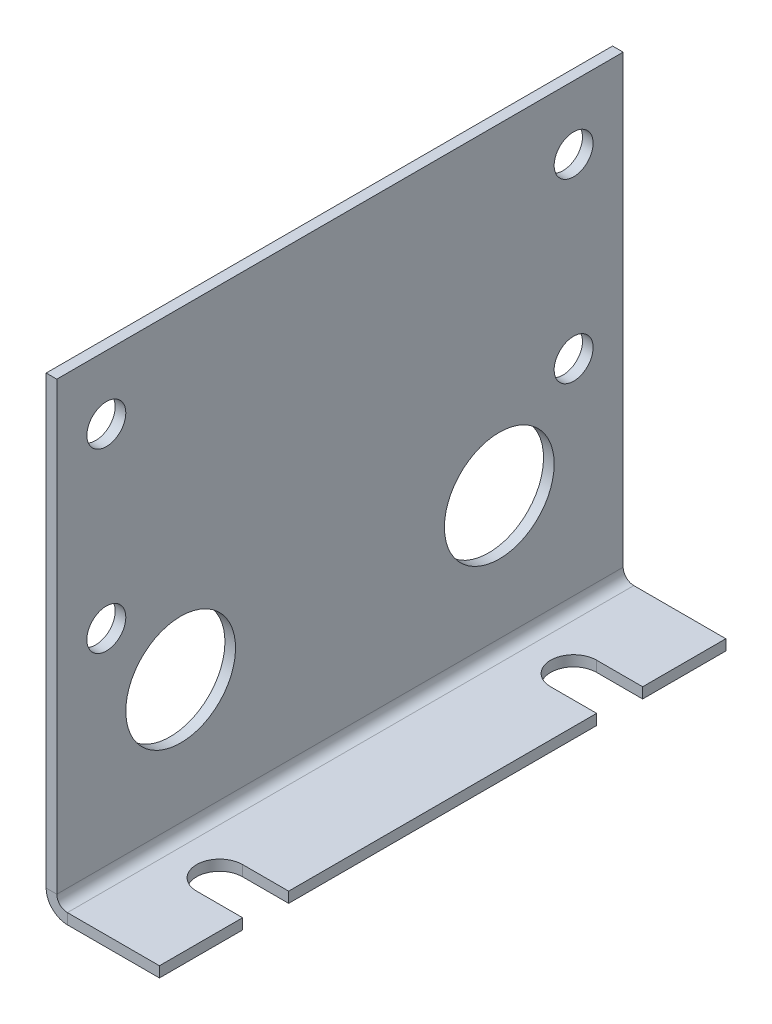
ISO-10303-21;
HEADER;
FILE_DESCRIPTION(('STEP AP214'),'2;1');
FILE_NAME('part.step','',(''),(''),'','','');
FILE_SCHEMA(('AUTOMOTIVE_DESIGN { 1 0 10303 214 1 1 1 1 }'));
ENDSEC;
DATA;
#1=APPLICATION_CONTEXT('core data for automotive mechanical design processes');
#2=APPLICATION_PROTOCOL_DEFINITION('international standard','automotive_design',2000,#1);
#3=PRODUCT_CONTEXT('',#1,'mechanical');
#4=PRODUCT('Part','Part','',(#3));
#5=PRODUCT_RELATED_PRODUCT_CATEGORY('part','',(#4));
#6=PRODUCT_DEFINITION_FORMATION('','',#4);
#7=PRODUCT_DEFINITION_CONTEXT('part definition',#1,'design');
#8=PRODUCT_DEFINITION('design','',#6,#7);
#9=PRODUCT_DEFINITION_SHAPE('','',#8);
#10=(LENGTH_UNIT() NAMED_UNIT(*) SI_UNIT(.MILLI.,.METRE.));
#11=(NAMED_UNIT(*) PLANE_ANGLE_UNIT() SI_UNIT($,.RADIAN.));
#12=(NAMED_UNIT(*) SI_UNIT($,.STERADIAN.) SOLID_ANGLE_UNIT());
#13=UNCERTAINTY_MEASURE_WITH_UNIT(LENGTH_MEASURE(1.E-05),#10,'distance_accuracy_value','');
#14=(GEOMETRIC_REPRESENTATION_CONTEXT(3) GLOBAL_UNCERTAINTY_ASSIGNED_CONTEXT((#13)) GLOBAL_UNIT_ASSIGNED_CONTEXT((#10,
#11,#12)) REPRESENTATION_CONTEXT('',''));
#15=CARTESIAN_POINT('',(0.,0.,0.));
#16=DIRECTION('',(0.,0.,1.));
#17=DIRECTION('',(1.,0.,0.));
#18=AXIS2_PLACEMENT_3D('',#15,#16,#17);
#19=CARTESIAN_POINT('',(29.,0.,80.));
#20=DIRECTION('',(1.,0.,0.));
#21=DIRECTION('',(0.,0.,-1.));
#22=AXIS2_PLACEMENT_3D('',#19,#20,#21);
#23=PLANE('',#22);
#24=DIRECTION('',(0.,1.,0.));
#25=VECTOR('',#24,1.);
#26=CARTESIAN_POINT('',(29.,-10.,43.5));
#27=LINE('',#26,#25);
#28=CARTESIAN_POINT('',(29.,-3.,43.5));
#29=VERTEX_POINT('',#28);
#30=CARTESIAN_POINT('',(29.,0.,43.5));
#31=VERTEX_POINT('',#30);
#32=EDGE_CURVE('E178',#29,#31,#27,.T.);
#33=ORIENTED_EDGE('',*,*,#32,.F.);
#34=DIRECTION('',(0.,0.,-1.));
#35=VECTOR('',#34,1.);
#36=CARTESIAN_POINT('',(29.,-3.,80.));
#37=LINE('',#36,#35);
#38=CARTESIAN_POINT('',(29.,-3.,-43.5));
#39=VERTEX_POINT('',#38);
#40=EDGE_CURVE('E190',#29,#39,#37,.T.);
#41=ORIENTED_EDGE('',*,*,#40,.T.);
#42=DIRECTION('',(0.,1.,0.));
#43=VECTOR('',#42,1.);
#44=CARTESIAN_POINT('',(29.,-10.,-43.5));
#45=LINE('',#44,#43);
#46=CARTESIAN_POINT('',(29.,0.,-43.5));
#47=VERTEX_POINT('',#46);
#48=EDGE_CURVE('E301',#39,#47,#45,.T.);
#49=ORIENTED_EDGE('',*,*,#48,.T.);
#50=DIRECTION('',(0.,0.,-1.));
#51=VECTOR('',#50,1.);
#52=CARTESIAN_POINT('',(29.,0.,80.));
#53=LINE('',#52,#51);
#54=EDGE_CURVE('E187',#31,#47,#53,.T.);
#55=ORIENTED_EDGE('',*,*,#54,.F.);
#56=EDGE_LOOP('',(#33,#41,#49,#55));
#57=FACE_BOUND('',#56,.T.);
#58=ADVANCED_FACE('F45',(#57),#23,.T.);
#59=DIRECTION('',(0.,1.,0.));
#60=VECTOR('',#59,1.);
#61=CARTESIAN_POINT('',(29.,-10.,-56.5));
#62=LINE('',#61,#60);
#63=CARTESIAN_POINT('',(29.,-3.,-56.5));
#64=VERTEX_POINT('',#63);
#65=CARTESIAN_POINT('',(29.,0.,-56.5));
#66=VERTEX_POINT('',#65);
#67=EDGE_CURVE('E305',#64,#66,#62,.T.);
#68=ORIENTED_EDGE('',*,*,#67,.F.);
#69=CARTESIAN_POINT('',(29.,-3.,-80.));
#70=VERTEX_POINT('',#69);
#71=EDGE_CURVE('E186',#64,#70,#37,.T.);
#72=ORIENTED_EDGE('',*,*,#71,.T.);
#73=DIRECTION('',(0.,-1.,0.));
#74=VECTOR('',#73,1.);
#75=CARTESIAN_POINT('',(29.,0.,-80.));
#76=LINE('',#75,#74);
#77=CARTESIAN_POINT('',(29.,0.,-80.));
#78=VERTEX_POINT('',#77);
#79=EDGE_CURVE('E237',#78,#70,#76,.T.);
#80=ORIENTED_EDGE('',*,*,#79,.F.);
#81=EDGE_CURVE('E189',#66,#78,#53,.T.);
#82=ORIENTED_EDGE('',*,*,#81,.F.);
#83=EDGE_LOOP('',(#68,#72,#80,#82));
#84=FACE_BOUND('',#83,.T.);
#85=ADVANCED_FACE('F339',(#84),#23,.T.);
#86=CARTESIAN_POINT('',(3.,0.,80.));
#87=DIRECTION('',(0.,0.,1.));
#88=DIRECTION('',(1.,0.,0.));
#89=AXIS2_PLACEMENT_3D('',#86,#87,#88);
#90=PLANE('',#89);
#91=DIRECTION('',(0.,-1.,0.));
#92=VECTOR('',#91,1.);
#93=CARTESIAN_POINT('',(3.,0.,80.));
#94=LINE('',#93,#92);
#95=CARTESIAN_POINT('',(3.,0.,80.));
#96=VERTEX_POINT('',#95);
#97=CARTESIAN_POINT('',(3.,-3.,80.));
#98=VERTEX_POINT('',#97);
#99=EDGE_CURVE('E11',#96,#98,#94,.T.);
#100=ORIENTED_EDGE('',*,*,#99,.F.);
#101=CARTESIAN_POINT('',(3.,3.,80.));
#102=DIRECTION('',(0.,0.,-1.));
#103=DIRECTION('',(-1.,0.,0.));
#104=AXIS2_PLACEMENT_3D('',#101,#102,#103);
#105=CIRCLE('',#104,3.);
#106=CARTESIAN_POINT('',(0.,3.,80.));
#107=VERTEX_POINT('',#106);
#108=EDGE_CURVE('E255',#107,#96,#105,.F.);
#109=ORIENTED_EDGE('',*,*,#108,.F.);
#110=DIRECTION('',(1.,0.,0.));
#111=VECTOR('',#110,1.);
#112=CARTESIAN_POINT('',(-3.,3.,80.));
#113=LINE('',#112,#111);
#114=CARTESIAN_POINT('',(-3.,3.,80.));
#115=VERTEX_POINT('',#114);
#116=EDGE_CURVE('E54',#115,#107,#113,.T.);
#117=ORIENTED_EDGE('',*,*,#116,.F.);
#118=CARTESIAN_POINT('',(3.,3.,80.));
#119=DIRECTION('',(0.,0.,1.));
#120=DIRECTION('',(1.,0.,0.));
#121=AXIS2_PLACEMENT_3D('',#118,#119,#120);
#122=CIRCLE('',#121,6.);
#123=EDGE_CURVE('E217',#115,#98,#122,.T.);
#124=ORIENTED_EDGE('',*,*,#123,.T.);
#125=EDGE_LOOP('',(#100,#109,#117,#124));
#126=FACE_BOUND('',#125,.T.);
#127=ADVANCED_FACE('F47',(#126),#90,.T.);
#128=CARTESIAN_POINT('',(-3.,3.,80.));
#129=DIRECTION('',(0.,0.,1.));
#130=DIRECTION('',(1.,0.,0.));
#131=AXIS2_PLACEMENT_3D('',#128,#129,#130);
#132=PLANE('',#131);
#133=DIRECTION('',(1.,0.,0.));
#134=VECTOR('',#133,1.);
#135=CARTESIAN_POINT('',(0.,0.,80.));
#136=LINE('',#135,#134);
#137=CARTESIAN_POINT('',(29.,0.,80.));
#138=VERTEX_POINT('',#137);
#139=EDGE_CURVE('E185',#96,#138,#136,.T.);
#140=ORIENTED_EDGE('',*,*,#139,.F.);
#141=ORIENTED_EDGE('',*,*,#99,.T.);
#142=DIRECTION('',(1.,0.,0.));
#143=VECTOR('',#142,1.);
#144=CARTESIAN_POINT('',(0.,-3.,80.));
#145=LINE('',#144,#143);
#146=CARTESIAN_POINT('',(29.,-3.,80.));
#147=VERTEX_POINT('',#146);
#148=EDGE_CURVE('E221',#98,#147,#145,.T.);
#149=ORIENTED_EDGE('',*,*,#148,.T.);
#150=DIRECTION('',(0.,-1.,0.));
#151=VECTOR('',#150,1.);
#152=CARTESIAN_POINT('',(29.,0.,80.));
#153=LINE('',#152,#151);
#154=EDGE_CURVE('E258',#138,#147,#153,.T.);
#155=ORIENTED_EDGE('',*,*,#154,.F.);
#156=EDGE_LOOP('',(#140,#141,#149,#155));
#157=FACE_BOUND('',#156,.T.);
#158=ADVANCED_FACE('F425',(#157),#132,.T.);
#159=CARTESIAN_POINT('',(0.,3.,-80.));
#160=DIRECTION('',(0.,0.,-1.));
#161=DIRECTION('',(-1.,0.,0.));
#162=AXIS2_PLACEMENT_3D('',#159,#160,#161);
#163=PLANE('',#162);
#164=DIRECTION('',(-1.,0.,0.));
#165=VECTOR('',#164,1.);
#166=CARTESIAN_POINT('',(0.,3.,-80.));
#167=LINE('',#166,#165);
#168=CARTESIAN_POINT('',(0.,3.,-80.));
#169=VERTEX_POINT('',#168);
#170=CARTESIAN_POINT('',(-3.,3.,-80.));
#171=VERTEX_POINT('',#170);
#172=EDGE_CURVE('E347',#169,#171,#167,.T.);
#173=ORIENTED_EDGE('',*,*,#172,.F.);
#174=CARTESIAN_POINT('',(3.,3.,-80.));
#175=DIRECTION('',(0.,0.,-1.));
#176=DIRECTION('',(-1.,0.,0.));
#177=AXIS2_PLACEMENT_3D('',#174,#175,#176);
#178=CIRCLE('',#177,3.);
#179=CARTESIAN_POINT('',(3.,0.,-80.));
#180=VERTEX_POINT('',#179);
#181=EDGE_CURVE('E231',#169,#180,#178,.F.);
#182=ORIENTED_EDGE('',*,*,#181,.T.);
#183=DIRECTION('',(0.,1.,0.));
#184=VECTOR('',#183,1.);
#185=CARTESIAN_POINT('',(3.,-3.,-80.));
#186=LINE('',#185,#184);
#187=CARTESIAN_POINT('',(3.,-3.,-80.));
#188=VERTEX_POINT('',#187);
#189=EDGE_CURVE('E343',#188,#180,#186,.T.);
#190=ORIENTED_EDGE('',*,*,#189,.F.);
#191=CARTESIAN_POINT('',(3.,3.,-80.));
#192=DIRECTION('',(0.,0.,1.));
#193=DIRECTION('',(1.,0.,0.));
#194=AXIS2_PLACEMENT_3D('',#191,#192,#193);
#195=CIRCLE('',#194,6.);
#196=EDGE_CURVE('E218',#171,#188,#195,.T.);
#197=ORIENTED_EDGE('',*,*,#196,.F.);
#198=EDGE_LOOP('',(#173,#182,#190,#197));
#199=FACE_BOUND('',#198,.T.);
#200=ADVANCED_FACE('F345',(#199),#163,.T.);
#201=CARTESIAN_POINT('',(3.,-3.,-80.));
#202=DIRECTION('',(0.,0.,-1.));
#203=DIRECTION('',(-1.,0.,0.));
#204=AXIS2_PLACEMENT_3D('',#201,#202,#203);
#205=PLANE('',#204);
#206=DIRECTION('',(0.,-1.,0.));
#207=VECTOR('',#206,1.);
#208=CARTESIAN_POINT('',(0.,129.,-80.));
#209=LINE('',#208,#207);
#210=CARTESIAN_POINT('',(0.,129.,-80.));
#211=VERTEX_POINT('',#210);
#212=EDGE_CURVE('E228',#211,#169,#209,.T.);
#213=ORIENTED_EDGE('',*,*,#212,.T.);
#214=ORIENTED_EDGE('',*,*,#172,.T.);
#215=DIRECTION('',(0.,-1.,0.));
#216=VECTOR('',#215,1.);
#217=CARTESIAN_POINT('',(-3.,129.,-80.));
#218=LINE('',#217,#216);
#219=CARTESIAN_POINT('',(-3.,129.,-80.));
#220=VERTEX_POINT('',#219);
#221=EDGE_CURVE('E222',#220,#171,#218,.T.);
#222=ORIENTED_EDGE('',*,*,#221,.F.);
#223=DIRECTION('',(1.,0.,0.));
#224=VECTOR('',#223,1.);
#225=CARTESIAN_POINT('',(-3.,129.,-80.));
#226=LINE('',#225,#224);
#227=EDGE_CURVE('E225',#220,#211,#226,.T.);
#228=ORIENTED_EDGE('',*,*,#227,.T.);
#229=EDGE_LOOP('',(#213,#214,#222,#228));
#230=FACE_BOUND('',#229,.T.);
#231=ADVANCED_FACE('F353',(#230),#205,.T.);
#232=CARTESIAN_POINT('',(0.,-3.,80.));
#233=DIRECTION('',(0.,1.,0.));
#234=DIRECTION('',(0.,0.,1.));
#235=AXIS2_PLACEMENT_3D('',#232,#233,#234);
#236=PLANE('',#235);
#237=ORIENTED_EDGE('',*,*,#40,.F.);
#238=DIRECTION('',(-1.,0.,0.));
#239=VECTOR('',#238,1.);
#240=CARTESIAN_POINT('',(0.,-3.,43.5));
#241=LINE('',#240,#239);
#242=CARTESIAN_POINT('',(16.,-3.,43.5));
#243=VERTEX_POINT('',#242);
#244=EDGE_CURVE('E284',#29,#243,#241,.T.);
#245=ORIENTED_EDGE('',*,*,#244,.T.);
#246=CARTESIAN_POINT('',(16.,-3.,50.));
#247=DIRECTION('',(0.,1.,0.));
#248=DIRECTION('',(0.,0.,1.));
#249=AXIS2_PLACEMENT_3D('',#246,#247,#248);
#250=CIRCLE('',#249,6.49999999999999);
#251=CARTESIAN_POINT('',(16.,-3.,56.5));
#252=VERTEX_POINT('',#251);
#253=EDGE_CURVE('E278',#243,#252,#250,.T.);
#254=ORIENTED_EDGE('',*,*,#253,.T.);
#255=DIRECTION('',(1.,0.,0.));
#256=VECTOR('',#255,1.);
#257=CARTESIAN_POINT('',(0.,-3.,56.5));
#258=LINE('',#257,#256);
#259=CARTESIAN_POINT('',(29.,-3.,56.5));
#260=VERTEX_POINT('',#259);
#261=EDGE_CURVE('E287',#252,#260,#258,.T.);
#262=ORIENTED_EDGE('',*,*,#261,.T.);
#263=EDGE_CURVE('E177',#147,#260,#37,.T.);
#264=ORIENTED_EDGE('',*,*,#263,.F.);
#265=ORIENTED_EDGE('',*,*,#148,.F.);
#266=DIRECTION('',(0.,0.,-1.));
#267=VECTOR('',#266,1.);
#268=CARTESIAN_POINT('',(3.,-3.,80.));
#269=LINE('',#268,#267);
#270=EDGE_CURVE('E214',#98,#188,#269,.T.);
#271=ORIENTED_EDGE('',*,*,#270,.T.);
#272=DIRECTION('',(1.,0.,0.));
#273=VECTOR('',#272,1.);
#274=CARTESIAN_POINT('',(0.,-3.,-80.));
#275=LINE('',#274,#273);
#276=EDGE_CURVE('E240',#188,#70,#275,.T.);
#277=ORIENTED_EDGE('',*,*,#276,.T.);
#278=ORIENTED_EDGE('',*,*,#71,.F.);
#279=DIRECTION('',(-1.,0.,0.));
#280=VECTOR('',#279,1.);
#281=CARTESIAN_POINT('',(0.,-3.,-56.5));
#282=LINE('',#281,#280);
#283=CARTESIAN_POINT('',(16.,-3.,-56.5));
#284=VERTEX_POINT('',#283);
#285=EDGE_CURVE('E292',#64,#284,#282,.T.);
#286=ORIENTED_EDGE('',*,*,#285,.T.);
#287=CARTESIAN_POINT('',(16.,-3.,-50.));
#288=DIRECTION('',(0.,1.,0.));
#289=DIRECTION('',(0.,0.,1.));
#290=AXIS2_PLACEMENT_3D('',#287,#288,#289);
#291=CIRCLE('',#290,6.49999999999999);
#292=CARTESIAN_POINT('',(16.,-3.,-43.5));
#293=VERTEX_POINT('',#292);
#294=EDGE_CURVE('E289',#284,#293,#291,.T.);
#295=ORIENTED_EDGE('',*,*,#294,.T.);
#296=DIRECTION('',(1.,0.,0.));
#297=VECTOR('',#296,1.);
#298=CARTESIAN_POINT('',(0.,-3.,-43.5));
#299=LINE('',#298,#297);
#300=EDGE_CURVE('E295',#293,#39,#299,.T.);
#301=ORIENTED_EDGE('',*,*,#300,.T.);
#302=EDGE_LOOP('',(#237,#245,#254,#262,#264,#265,#271,#277,#278,#286,#295,#301));
#303=FACE_BOUND('',#302,.T.);
#304=ADVANCED_FACE('F331',(#303),#236,.F.);
#305=DIRECTION('',(0.,1.,0.));
#306=VECTOR('',#305,1.);
#307=CARTESIAN_POINT('',(29.,-10.,56.5));
#308=LINE('',#307,#306);
#309=CARTESIAN_POINT('',(29.,0.,56.5));
#310=VERTEX_POINT('',#309);
#311=EDGE_CURVE('E163',#260,#310,#308,.T.);
#312=ORIENTED_EDGE('',*,*,#311,.T.);
#313=EDGE_CURVE('E174',#138,#310,#53,.T.);
#314=ORIENTED_EDGE('',*,*,#313,.F.);
#315=ORIENTED_EDGE('',*,*,#154,.T.);
#316=ORIENTED_EDGE('',*,*,#263,.T.);
#317=EDGE_LOOP('',(#312,#314,#315,#316));
#318=FACE_BOUND('',#317,.T.);
#319=ADVANCED_FACE('F172',(#318),#23,.T.);
#320=CARTESIAN_POINT('',(0.,0.,80.));
#321=DIRECTION('',(0.,1.,0.));
#322=DIRECTION('',(0.,0.,1.));
#323=AXIS2_PLACEMENT_3D('',#320,#321,#322);
#324=PLANE('',#323);
#325=DIRECTION('',(-1.,0.,0.));
#326=VECTOR('',#325,1.);
#327=CARTESIAN_POINT('',(16.,0.,43.5));
#328=LINE('',#327,#326);
#329=CARTESIAN_POINT('',(16.,0.,43.5));
#330=VERTEX_POINT('',#329);
#331=EDGE_CURVE('E168',#31,#330,#328,.T.);
#332=ORIENTED_EDGE('',*,*,#331,.F.);
#333=ORIENTED_EDGE('',*,*,#54,.T.);
#334=DIRECTION('',(1.,0.,0.));
#335=VECTOR('',#334,1.);
#336=CARTESIAN_POINT('',(16.,0.,-43.5));
#337=LINE('',#336,#335);
#338=CARTESIAN_POINT('',(16.,0.,-43.5));
#339=VERTEX_POINT('',#338);
#340=EDGE_CURVE('E311',#339,#47,#337,.T.);
#341=ORIENTED_EDGE('',*,*,#340,.F.);
#342=CARTESIAN_POINT('',(16.,0.,-50.));
#343=DIRECTION('',(0.,1.,0.));
#344=DIRECTION('',(0.,0.,1.));
#345=AXIS2_PLACEMENT_3D('',#342,#343,#344);
#346=CIRCLE('',#345,6.49999999999999);
#347=CARTESIAN_POINT('',(16.,0.,-56.5));
#348=VERTEX_POINT('',#347);
#349=EDGE_CURVE('E70',#348,#339,#346,.T.);
#350=ORIENTED_EDGE('',*,*,#349,.F.);
#351=DIRECTION('',(-1.,0.,0.));
#352=VECTOR('',#351,1.);
#353=CARTESIAN_POINT('',(16.,0.,-56.5));
#354=LINE('',#353,#352);
#355=EDGE_CURVE('E302',#66,#348,#354,.T.);
#356=ORIENTED_EDGE('',*,*,#355,.F.);
#357=ORIENTED_EDGE('',*,*,#81,.T.);
#358=DIRECTION('',(1.,0.,0.));
#359=VECTOR('',#358,1.);
#360=CARTESIAN_POINT('',(0.,0.,-80.));
#361=LINE('',#360,#359);
#362=EDGE_CURVE('E234',#180,#78,#361,.T.);
#363=ORIENTED_EDGE('',*,*,#362,.F.);
#364=DIRECTION('',(0.,0.,-1.));
#365=VECTOR('',#364,1.);
#366=CARTESIAN_POINT('',(3.,0.,80.));
#367=LINE('',#366,#365);
#368=EDGE_CURVE('E194',#96,#180,#367,.T.);
#369=ORIENTED_EDGE('',*,*,#368,.F.);
#370=ORIENTED_EDGE('',*,*,#139,.T.);
#371=ORIENTED_EDGE('',*,*,#313,.T.);
#372=DIRECTION('',(1.,0.,0.));
#373=VECTOR('',#372,1.);
#374=CARTESIAN_POINT('',(16.,0.,56.5));
#375=LINE('',#374,#373);
#376=CARTESIAN_POINT('',(16.,0.,56.5));
#377=VERTEX_POINT('',#376);
#378=EDGE_CURVE('E160',#377,#310,#375,.T.);
#379=ORIENTED_EDGE('',*,*,#378,.F.);
#380=CARTESIAN_POINT('',(16.,0.,50.));
#381=DIRECTION('',(0.,1.,0.));
#382=DIRECTION('',(0.,0.,1.));
#383=AXIS2_PLACEMENT_3D('',#380,#381,#382);
#384=CIRCLE('',#383,6.49999999999999);
#385=EDGE_CURVE('E62',#330,#377,#384,.T.);
#386=ORIENTED_EDGE('',*,*,#385,.F.);
#387=EDGE_LOOP('',(#332,#333,#341,#350,#356,#357,#363,#369,#370,#371,#379,#386));
#388=FACE_BOUND('',#387,.T.);
#389=ADVANCED_FACE('F182',(#388),#324,.T.);
#390=CARTESIAN_POINT('',(3.,3.,80.));
#391=DIRECTION('',(0.,0.,-1.));
#392=DIRECTION('',(-1.,0.,0.));
#393=AXIS2_PLACEMENT_3D('',#390,#391,#392);
#394=CYLINDRICAL_SURFACE('',#393,3.);
#395=ORIENTED_EDGE('',*,*,#181,.F.);
#396=DIRECTION('',(0.,0.,-1.));
#397=VECTOR('',#396,1.);
#398=CARTESIAN_POINT('',(0.,3.,80.));
#399=LINE('',#398,#397);
#400=EDGE_CURVE('E200',#107,#169,#399,.T.);
#401=ORIENTED_EDGE('',*,*,#400,.F.);
#402=ORIENTED_EDGE('',*,*,#108,.T.);
#403=ORIENTED_EDGE('',*,*,#368,.T.);
#404=EDGE_LOOP('',(#395,#401,#402,#403));
#405=FACE_BOUND('',#404,.T.);
#406=ADVANCED_FACE('F349',(#405),#394,.F.);
#407=CARTESIAN_POINT('',(0.,129.,80.));
#408=DIRECTION('',(1.,0.,0.));
#409=DIRECTION('',(0.,1.,0.));
#410=AXIS2_PLACEMENT_3D('',#407,#408,#409);
#411=PLANE('',#410);
#412=CARTESIAN_POINT('',(0.,38.,45.));
#413=DIRECTION('',(1.,0.,0.));
#414=DIRECTION('',(0.,1.,0.));
#415=AXIS2_PLACEMENT_3D('',#412,#413,#414);
#416=CIRCLE('',#415,15.5);
#417=CARTESIAN_POINT('',(0.,53.5,45.));
#418=VERTEX_POINT('',#417);
#419=EDGE_CURVE('E277',#418,#418,#416,.T.);
#420=ORIENTED_EDGE('',*,*,#419,.F.);
#421=EDGE_LOOP('',(#420));
#422=FACE_BOUND('',#421,.T.);
#423=CARTESIAN_POINT('',(0.,38.,-45.));
#424=DIRECTION('',(1.,0.,0.));
#425=DIRECTION('',(0.,-1.,0.));
#426=AXIS2_PLACEMENT_3D('',#423,#424,#425);
#427=CIRCLE('',#426,15.5);
#428=CARTESIAN_POINT('',(0.,22.5,-45.));
#429=VERTEX_POINT('',#428);
#430=EDGE_CURVE('E274',#429,#429,#427,.T.);
#431=ORIENTED_EDGE('',*,*,#430,.F.);
#432=EDGE_LOOP('',(#431));
#433=FACE_BOUND('',#432,.T.);
#434=CARTESIAN_POINT('',(0.,61.,66.));
#435=DIRECTION('',(1.,0.,0.));
#436=DIRECTION('',(0.,1.,0.));
#437=AXIS2_PLACEMENT_3D('',#434,#435,#436);
#438=CIRCLE('',#437,5.5);
#439=CARTESIAN_POINT('',(0.,66.5,66.));
#440=VERTEX_POINT('',#439);
#441=EDGE_CURVE('E266',#440,#440,#438,.T.);
#442=ORIENTED_EDGE('',*,*,#441,.F.);
#443=EDGE_LOOP('',(#442));
#444=FACE_BOUND('',#443,.T.);
#445=CARTESIAN_POINT('',(0.,61.,-66.));
#446=DIRECTION('',(1.,0.,0.));
#447=DIRECTION('',(0.,1.,0.));
#448=AXIS2_PLACEMENT_3D('',#445,#446,#447);
#449=CIRCLE('',#448,5.49999999999999);
#450=CARTESIAN_POINT('',(0.,66.5,-66.));
#451=VERTEX_POINT('',#450);
#452=EDGE_CURVE('E269',#451,#451,#449,.T.);
#453=ORIENTED_EDGE('',*,*,#452,.F.);
#454=EDGE_LOOP('',(#453));
#455=FACE_BOUND('',#454,.T.);
#456=CARTESIAN_POINT('',(0.,111.,-66.));
#457=DIRECTION('',(1.,0.,0.));
#458=DIRECTION('',(0.,1.,0.));
#459=AXIS2_PLACEMENT_3D('',#456,#457,#458);
#460=CIRCLE('',#459,5.49999999999999);
#461=CARTESIAN_POINT('',(0.,116.5,-66.));
#462=VERTEX_POINT('',#461);
#463=EDGE_CURVE('E265',#462,#462,#460,.T.);
#464=ORIENTED_EDGE('',*,*,#463,.F.);
#465=EDGE_LOOP('',(#464));
#466=FACE_BOUND('',#465,.T.);
#467=CARTESIAN_POINT('',(0.,111.,66.));
#468=DIRECTION('',(1.,0.,0.));
#469=DIRECTION('',(0.,1.,0.));
#470=AXIS2_PLACEMENT_3D('',#467,#468,#469);
#471=CIRCLE('',#470,5.5);
#472=CARTESIAN_POINT('',(0.,116.5,66.));
#473=VERTEX_POINT('',#472);
#474=EDGE_CURVE('E261',#473,#473,#471,.T.);
#475=ORIENTED_EDGE('',*,*,#474,.F.);
#476=EDGE_LOOP('',(#475));
#477=FACE_BOUND('',#476,.T.);
#478=ORIENTED_EDGE('',*,*,#212,.F.);
#479=DIRECTION('',(0.,0.,-1.));
#480=VECTOR('',#479,1.);
#481=CARTESIAN_POINT('',(0.,129.,80.));
#482=LINE('',#481,#480);
#483=CARTESIAN_POINT('',(0.,129.,80.));
#484=VERTEX_POINT('',#483);
#485=EDGE_CURVE('E205',#484,#211,#482,.T.);
#486=ORIENTED_EDGE('',*,*,#485,.F.);
#487=DIRECTION('',(0.,-1.,0.));
#488=VECTOR('',#487,1.);
#489=CARTESIAN_POINT('',(0.,129.,80.));
#490=LINE('',#489,#488);
#491=EDGE_CURVE('E252',#484,#107,#490,.T.);
#492=ORIENTED_EDGE('',*,*,#491,.T.);
#493=ORIENTED_EDGE('',*,*,#400,.T.);
#494=EDGE_LOOP('',(#478,#486,#492,#493));
#495=FACE_BOUND('',#494,.T.);
#496=ADVANCED_FACE('F357',(#422,#433,#444,#455,#466,#477,#495),#411,.T.);
#497=CARTESIAN_POINT('',(-3.,129.,80.));
#498=DIRECTION('',(0.,1.,0.));
#499=DIRECTION('',(0.,0.,1.));
#500=AXIS2_PLACEMENT_3D('',#497,#498,#499);
#501=PLANE('',#500);
#502=ORIENTED_EDGE('',*,*,#227,.F.);
#503=DIRECTION('',(0.,0.,-1.));
#504=VECTOR('',#503,1.);
#505=CARTESIAN_POINT('',(-3.,129.,80.));
#506=LINE('',#505,#504);
#507=CARTESIAN_POINT('',(-3.,129.,80.));
#508=VERTEX_POINT('',#507);
#509=EDGE_CURVE('E209',#508,#220,#506,.T.);
#510=ORIENTED_EDGE('',*,*,#509,.F.);
#511=DIRECTION('',(1.,0.,0.));
#512=VECTOR('',#511,1.);
#513=CARTESIAN_POINT('',(-3.,129.,80.));
#514=LINE('',#513,#512);
#515=EDGE_CURVE('E249',#508,#484,#514,.T.);
#516=ORIENTED_EDGE('',*,*,#515,.T.);
#517=ORIENTED_EDGE('',*,*,#485,.T.);
#518=EDGE_LOOP('',(#502,#510,#516,#517));
#519=FACE_BOUND('',#518,.T.);
#520=ADVANCED_FACE('F363',(#519),#501,.T.);
#521=CARTESIAN_POINT('',(-3.,129.,80.));
#522=DIRECTION('',(1.,0.,0.));
#523=DIRECTION('',(0.,1.,0.));
#524=AXIS2_PLACEMENT_3D('',#521,#522,#523);
#525=PLANE('',#524);
#526=CARTESIAN_POINT('',(-3.,38.,45.));
#527=DIRECTION('',(1.,0.,0.));
#528=DIRECTION('',(0.,1.,0.));
#529=AXIS2_PLACEMENT_3D('',#526,#527,#528);
#530=CIRCLE('',#529,15.5);
#531=CARTESIAN_POINT('',(-3.,53.5,45.));
#532=VERTEX_POINT('',#531);
#533=EDGE_CURVE('E49',#532,#532,#530,.T.);
#534=ORIENTED_EDGE('',*,*,#533,.T.);
#535=EDGE_LOOP('',(#534));
#536=FACE_BOUND('',#535,.T.);
#537=CARTESIAN_POINT('',(-3.,38.,-45.));
#538=DIRECTION('',(1.,0.,0.));
#539=DIRECTION('',(0.,1.,0.));
#540=AXIS2_PLACEMENT_3D('',#537,#538,#539);
#541=CIRCLE('',#540,15.5);
#542=CARTESIAN_POINT('',(-3.,53.5,-45.));
#543=VERTEX_POINT('',#542);
#544=EDGE_CURVE('E281',#543,#543,#541,.T.);
#545=ORIENTED_EDGE('',*,*,#544,.T.);
#546=EDGE_LOOP('',(#545));
#547=FACE_BOUND('',#546,.T.);
#548=CARTESIAN_POINT('',(-3.,61.,66.));
#549=DIRECTION('',(1.,0.,0.));
#550=DIRECTION('',(0.,1.,0.));
#551=AXIS2_PLACEMENT_3D('',#548,#549,#550);
#552=CIRCLE('',#551,5.5);
#553=CARTESIAN_POINT('',(-3.,66.5,66.));
#554=VERTEX_POINT('',#553);
#555=EDGE_CURVE('E243',#554,#554,#552,.T.);
#556=ORIENTED_EDGE('',*,*,#555,.T.);
#557=EDGE_LOOP('',(#556));
#558=FACE_BOUND('',#557,.T.);
#559=CARTESIAN_POINT('',(-3.,61.,-66.));
#560=DIRECTION('',(1.,0.,0.));
#561=DIRECTION('',(0.,1.,0.));
#562=AXIS2_PLACEMENT_3D('',#559,#560,#561);
#563=CIRCLE('',#562,5.49999999999999);
#564=CARTESIAN_POINT('',(-3.,66.5,-66.));
#565=VERTEX_POINT('',#564);
#566=EDGE_CURVE('E383',#565,#565,#563,.T.);
#567=ORIENTED_EDGE('',*,*,#566,.T.);
#568=EDGE_LOOP('',(#567));
#569=FACE_BOUND('',#568,.T.);
#570=CARTESIAN_POINT('',(-3.,111.,-66.));
#571=DIRECTION('',(1.,0.,0.));
#572=DIRECTION('',(0.,1.,0.));
#573=AXIS2_PLACEMENT_3D('',#570,#571,#572);
#574=CIRCLE('',#573,5.49999999999999);
#575=CARTESIAN_POINT('',(-3.,116.5,-66.));
#576=VERTEX_POINT('',#575);
#577=EDGE_CURVE('E380',#576,#576,#574,.T.);
#578=ORIENTED_EDGE('',*,*,#577,.T.);
#579=EDGE_LOOP('',(#578));
#580=FACE_BOUND('',#579,.T.);
#581=CARTESIAN_POINT('',(-3.,111.,66.));
#582=DIRECTION('',(1.,0.,0.));
#583=DIRECTION('',(0.,1.,0.));
#584=AXIS2_PLACEMENT_3D('',#581,#582,#583);
#585=CIRCLE('',#584,5.5);
#586=CARTESIAN_POINT('',(-3.,116.5,66.));
#587=VERTEX_POINT('',#586);
#588=EDGE_CURVE('E264',#587,#587,#585,.T.);
#589=ORIENTED_EDGE('',*,*,#588,.T.);
#590=EDGE_LOOP('',(#589));
#591=FACE_BOUND('',#590,.T.);
#592=ORIENTED_EDGE('',*,*,#221,.T.);
#593=DIRECTION('',(0.,0.,-1.));
#594=VECTOR('',#593,1.);
#595=CARTESIAN_POINT('',(-3.,3.,80.));
#596=LINE('',#595,#594);
#597=EDGE_CURVE('E211',#115,#171,#596,.T.);
#598=ORIENTED_EDGE('',*,*,#597,.F.);
#599=DIRECTION('',(0.,-1.,0.));
#600=VECTOR('',#599,1.);
#601=CARTESIAN_POINT('',(-3.,129.,80.));
#602=LINE('',#601,#600);
#603=EDGE_CURVE('E246',#508,#115,#602,.T.);
#604=ORIENTED_EDGE('',*,*,#603,.F.);
#605=ORIENTED_EDGE('',*,*,#509,.T.);
#606=EDGE_LOOP('',(#592,#598,#604,#605));
#607=FACE_BOUND('',#606,.T.);
#608=ADVANCED_FACE('F367',(#536,#547,#558,#569,#580,#591,#607),#525,.F.);
#609=CARTESIAN_POINT('',(3.,3.,80.));
#610=DIRECTION('',(0.,0.,-1.));
#611=DIRECTION('',(-1.,0.,0.));
#612=AXIS2_PLACEMENT_3D('',#609,#610,#611);
#613=CYLINDRICAL_SURFACE('',#612,6.);
#614=ORIENTED_EDGE('',*,*,#196,.T.);
#615=ORIENTED_EDGE('',*,*,#270,.F.);
#616=ORIENTED_EDGE('',*,*,#123,.F.);
#617=ORIENTED_EDGE('',*,*,#597,.T.);
#618=EDGE_LOOP('',(#614,#615,#616,#617));
#619=FACE_BOUND('',#618,.T.);
#620=ADVANCED_FACE('F371',(#619),#613,.T.);
#621=CARTESIAN_POINT('',(3.,3.,80.));
#622=DIRECTION('',(0.,0.,-1.));
#623=DIRECTION('',(-1.,0.,0.));
#624=AXIS2_PLACEMENT_3D('',#621,#622,#623);
#625=PLANE('',#624);
#626=ORIENTED_EDGE('',*,*,#603,.T.);
#627=ORIENTED_EDGE('',*,*,#116,.T.);
#628=ORIENTED_EDGE('',*,*,#491,.F.);
#629=ORIENTED_EDGE('',*,*,#515,.F.);
#630=EDGE_LOOP('',(#626,#627,#628,#629));
#631=FACE_BOUND('',#630,.T.);
#632=ADVANCED_FACE('F361',(#631),#625,.F.);
#633=CARTESIAN_POINT('',(3.,3.,-80.));
#634=DIRECTION('',(0.,0.,-1.));
#635=DIRECTION('',(-1.,0.,0.));
#636=AXIS2_PLACEMENT_3D('',#633,#634,#635);
#637=PLANE('',#636);
#638=ORIENTED_EDGE('',*,*,#276,.F.);
#639=ORIENTED_EDGE('',*,*,#189,.T.);
#640=ORIENTED_EDGE('',*,*,#362,.T.);
#641=ORIENTED_EDGE('',*,*,#79,.T.);
#642=EDGE_LOOP('',(#638,#639,#640,#641));
#643=FACE_BOUND('',#642,.T.);
#644=ADVANCED_FACE('F342',(#643),#637,.T.);
#645=CARTESIAN_POINT('',(-10.,111.,66.));
#646=DIRECTION('',(1.,0.,0.));
#647=DIRECTION('',(0.,1.,0.));
#648=AXIS2_PLACEMENT_3D('',#645,#646,#647);
#649=CYLINDRICAL_SURFACE('',#648,5.5);
#650=ORIENTED_EDGE('',*,*,#474,.T.);
#651=EDGE_LOOP('',(#650));
#652=FACE_BOUND('',#651,.T.);
#653=ORIENTED_EDGE('',*,*,#588,.F.);
#654=EDGE_LOOP('',(#653));
#655=FACE_BOUND('',#654,.T.);
#656=ADVANCED_FACE('F530',(#652,#655),#649,.F.);
#657=CARTESIAN_POINT('',(-10.,111.,-66.));
#658=DIRECTION('',(1.,0.,0.));
#659=DIRECTION('',(0.,1.,0.));
#660=AXIS2_PLACEMENT_3D('',#657,#658,#659);
#661=CYLINDRICAL_SURFACE('',#660,5.49999999999999);
#662=ORIENTED_EDGE('',*,*,#463,.T.);
#663=EDGE_LOOP('',(#662));
#664=FACE_BOUND('',#663,.T.);
#665=ORIENTED_EDGE('',*,*,#577,.F.);
#666=EDGE_LOOP('',(#665));
#667=FACE_BOUND('',#666,.T.);
#668=ADVANCED_FACE('F521',(#664,#667),#661,.F.);
#669=CARTESIAN_POINT('',(-10.,61.,-66.));
#670=DIRECTION('',(1.,0.,0.));
#671=DIRECTION('',(0.,1.,0.));
#672=AXIS2_PLACEMENT_3D('',#669,#670,#671);
#673=CYLINDRICAL_SURFACE('',#672,5.49999999999999);
#674=ORIENTED_EDGE('',*,*,#452,.T.);
#675=EDGE_LOOP('',(#674));
#676=FACE_BOUND('',#675,.T.);
#677=ORIENTED_EDGE('',*,*,#566,.F.);
#678=EDGE_LOOP('',(#677));
#679=FACE_BOUND('',#678,.T.);
#680=ADVANCED_FACE('F512',(#676,#679),#673,.F.);
#681=CARTESIAN_POINT('',(-10.,61.,66.));
#682=DIRECTION('',(1.,0.,0.));
#683=DIRECTION('',(0.,1.,0.));
#684=AXIS2_PLACEMENT_3D('',#681,#682,#683);
#685=CYLINDRICAL_SURFACE('',#684,5.5);
#686=ORIENTED_EDGE('',*,*,#441,.T.);
#687=EDGE_LOOP('',(#686));
#688=FACE_BOUND('',#687,.T.);
#689=ORIENTED_EDGE('',*,*,#555,.F.);
#690=EDGE_LOOP('',(#689));
#691=FACE_BOUND('',#690,.T.);
#692=ADVANCED_FACE('F405',(#688,#691),#685,.F.);
#693=CARTESIAN_POINT('',(-10.,38.,-45.));
#694=DIRECTION('',(1.,0.,0.));
#695=DIRECTION('',(0.,1.,0.));
#696=AXIS2_PLACEMENT_3D('',#693,#694,#695);
#697=CYLINDRICAL_SURFACE('',#696,15.5);
#698=ORIENTED_EDGE('',*,*,#430,.T.);
#699=EDGE_LOOP('',(#698));
#700=FACE_BOUND('',#699,.T.);
#701=ORIENTED_EDGE('',*,*,#544,.F.);
#702=EDGE_LOOP('',(#701));
#703=FACE_BOUND('',#702,.T.);
#704=ADVANCED_FACE('F396',(#700,#703),#697,.F.);
#705=CARTESIAN_POINT('',(-10.,38.,45.));
#706=DIRECTION('',(1.,0.,0.));
#707=DIRECTION('',(0.,1.,0.));
#708=AXIS2_PLACEMENT_3D('',#705,#706,#707);
#709=CYLINDRICAL_SURFACE('',#708,15.5);
#710=ORIENTED_EDGE('',*,*,#419,.T.);
#711=EDGE_LOOP('',(#710));
#712=FACE_BOUND('',#711,.T.);
#713=ORIENTED_EDGE('',*,*,#533,.F.);
#714=EDGE_LOOP('',(#713));
#715=FACE_BOUND('',#714,.T.);
#716=ADVANCED_FACE('F394',(#712,#715),#709,.F.);
#717=CARTESIAN_POINT('',(16.,-10.,-50.));
#718=DIRECTION('',(0.,1.,0.));
#719=DIRECTION('',(0.,0.,1.));
#720=AXIS2_PLACEMENT_3D('',#717,#718,#719);
#721=CYLINDRICAL_SURFACE('',#720,6.49999999999999);
#722=DIRECTION('',(0.,1.,0.));
#723=VECTOR('',#722,1.);
#724=CARTESIAN_POINT('',(16.,-10.,-56.5));
#725=LINE('',#724,#723);
#726=EDGE_CURVE('E307',#284,#348,#725,.T.);
#727=ORIENTED_EDGE('',*,*,#726,.T.);
#728=ORIENTED_EDGE('',*,*,#349,.T.);
#729=DIRECTION('',(0.,1.,0.));
#730=VECTOR('',#729,1.);
#731=CARTESIAN_POINT('',(16.,-10.,-43.5));
#732=LINE('',#731,#730);
#733=EDGE_CURVE('E299',#293,#339,#732,.T.);
#734=ORIENTED_EDGE('',*,*,#733,.F.);
#735=ORIENTED_EDGE('',*,*,#294,.F.);
#736=EDGE_LOOP('',(#727,#728,#734,#735));
#737=FACE_BOUND('',#736,.T.);
#738=ADVANCED_FACE('F334',(#737),#721,.F.);
#739=CARTESIAN_POINT('',(16.,-10.,-56.5));
#740=DIRECTION('',(0.,0.,-1.));
#741=DIRECTION('',(-1.,0.,0.));
#742=AXIS2_PLACEMENT_3D('',#739,#740,#741);
#743=PLANE('',#742);
#744=ORIENTED_EDGE('',*,*,#67,.T.);
#745=ORIENTED_EDGE('',*,*,#355,.T.);
#746=ORIENTED_EDGE('',*,*,#726,.F.);
#747=ORIENTED_EDGE('',*,*,#285,.F.);
#748=EDGE_LOOP('',(#744,#745,#746,#747));
#749=FACE_BOUND('',#748,.T.);
#750=ADVANCED_FACE('F336',(#749),#743,.F.);
#751=CARTESIAN_POINT('',(16.,-10.,-43.5));
#752=DIRECTION('',(0.,0.,1.));
#753=DIRECTION('',(1.,0.,0.));
#754=AXIS2_PLACEMENT_3D('',#751,#752,#753);
#755=PLANE('',#754);
#756=ORIENTED_EDGE('',*,*,#733,.T.);
#757=ORIENTED_EDGE('',*,*,#340,.T.);
#758=ORIENTED_EDGE('',*,*,#48,.F.);
#759=ORIENTED_EDGE('',*,*,#300,.F.);
#760=EDGE_LOOP('',(#756,#757,#758,#759));
#761=FACE_BOUND('',#760,.T.);
#762=ADVANCED_FACE('F329',(#761),#755,.F.);
#763=CARTESIAN_POINT('',(16.,-10.,50.));
#764=DIRECTION('',(0.,1.,0.));
#765=DIRECTION('',(0.,0.,1.));
#766=AXIS2_PLACEMENT_3D('',#763,#764,#765);
#767=CYLINDRICAL_SURFACE('',#766,6.49999999999999);
#768=DIRECTION('',(0.,1.,0.));
#769=VECTOR('',#768,1.);
#770=CARTESIAN_POINT('',(16.,-10.,43.5));
#771=LINE('',#770,#769);
#772=EDGE_CURVE('E298',#243,#330,#771,.T.);
#773=ORIENTED_EDGE('',*,*,#772,.T.);
#774=ORIENTED_EDGE('',*,*,#385,.T.);
#775=DIRECTION('',(0.,1.,0.));
#776=VECTOR('',#775,1.);
#777=CARTESIAN_POINT('',(16.,-10.,56.5));
#778=LINE('',#777,#776);
#779=EDGE_CURVE('E165',#252,#377,#778,.T.);
#780=ORIENTED_EDGE('',*,*,#779,.F.);
#781=ORIENTED_EDGE('',*,*,#253,.F.);
#782=EDGE_LOOP('',(#773,#774,#780,#781));
#783=FACE_BOUND('',#782,.T.);
#784=ADVANCED_FACE('F431',(#783),#767,.F.);
#785=CARTESIAN_POINT('',(16.,-10.,43.5));
#786=DIRECTION('',(0.,0.,-1.));
#787=DIRECTION('',(-1.,0.,0.));
#788=AXIS2_PLACEMENT_3D('',#785,#786,#787);
#789=PLANE('',#788);
#790=ORIENTED_EDGE('',*,*,#32,.T.);
#791=ORIENTED_EDGE('',*,*,#331,.T.);
#792=ORIENTED_EDGE('',*,*,#772,.F.);
#793=ORIENTED_EDGE('',*,*,#244,.F.);
#794=EDGE_LOOP('',(#790,#791,#792,#793));
#795=FACE_BOUND('',#794,.T.);
#796=ADVANCED_FACE('F321',(#795),#789,.F.);
#797=CARTESIAN_POINT('',(16.,-10.,56.5));
#798=DIRECTION('',(0.,0.,1.));
#799=DIRECTION('',(1.,0.,0.));
#800=AXIS2_PLACEMENT_3D('',#797,#798,#799);
#801=PLANE('',#800);
#802=ORIENTED_EDGE('',*,*,#779,.T.);
#803=ORIENTED_EDGE('',*,*,#378,.T.);
#804=ORIENTED_EDGE('',*,*,#311,.F.);
#805=ORIENTED_EDGE('',*,*,#261,.F.);
#806=EDGE_LOOP('',(#802,#803,#804,#805));
#807=FACE_BOUND('',#806,.T.);
#808=ADVANCED_FACE('F162',(#807),#801,.F.);
#809=CLOSED_SHELL('',(#58,#85,#127,#158,#200,#231,#304,#319,#389,#406,#496,#520,#608,#620,#632,
#644,#656,#668,#680,#692,#704,#716,#738,#750,#762,#784,#796,#808));
#810=MANIFOLD_SOLID_BREP('B2',#809);
#811=ADVANCED_BREP_SHAPE_REPRESENTATION('',(#18,#810),#14);
#812=SHAPE_DEFINITION_REPRESENTATION(#9,#811);
ENDSEC;
END-ISO-10303-21;
